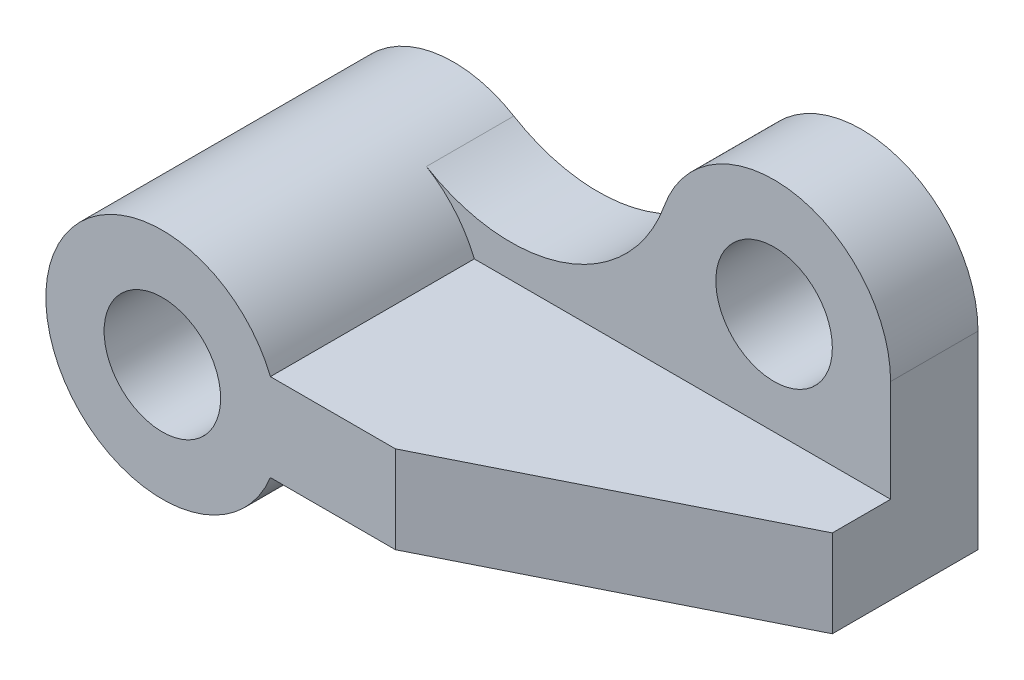
ISO-10303-21;
HEADER;
FILE_DESCRIPTION(('STEP AP214'),'2;1');
FILE_NAME('part.step','',(''),(''),'','','');
FILE_SCHEMA(('AUTOMOTIVE_DESIGN { 1 0 10303 214 1 1 1 1 }'));
ENDSEC;
DATA;
#1=APPLICATION_CONTEXT('core data for automotive mechanical design processes');
#2=APPLICATION_PROTOCOL_DEFINITION('international standard','automotive_design',2000,#1);
#3=PRODUCT_CONTEXT('',#1,'mechanical');
#4=PRODUCT('Part','Part','',(#3));
#5=PRODUCT_RELATED_PRODUCT_CATEGORY('part','',(#4));
#6=PRODUCT_DEFINITION_FORMATION('','',#4);
#7=PRODUCT_DEFINITION_CONTEXT('part definition',#1,'design');
#8=PRODUCT_DEFINITION('design','',#6,#7);
#9=PRODUCT_DEFINITION_SHAPE('','',#8);
#10=(LENGTH_UNIT() NAMED_UNIT(*) SI_UNIT(.MILLI.,.METRE.));
#11=(NAMED_UNIT(*) PLANE_ANGLE_UNIT() SI_UNIT($,.RADIAN.));
#12=(NAMED_UNIT(*) SI_UNIT($,.STERADIAN.) SOLID_ANGLE_UNIT());
#13=UNCERTAINTY_MEASURE_WITH_UNIT(LENGTH_MEASURE(1.E-05),#10,'distance_accuracy_value','');
#14=(GEOMETRIC_REPRESENTATION_CONTEXT(3) GLOBAL_UNCERTAINTY_ASSIGNED_CONTEXT((#13)) GLOBAL_UNIT_ASSIGNED_CONTEXT((#10,
#11,#12)) REPRESENTATION_CONTEXT('',''));
#15=CARTESIAN_POINT('',(0.,0.,0.));
#16=DIRECTION('',(0.,0.,1.));
#17=DIRECTION('',(1.,0.,0.));
#18=AXIS2_PLACEMENT_3D('',#15,#16,#17);
#19=CARTESIAN_POINT('',(0.,7.5,50.));
#20=DIRECTION('',(0.,1.,0.));
#21=DIRECTION('',(-1.,0.,0.));
#22=AXIS2_PLACEMENT_3D('',#19,#20,#21);
#23=PLANE('',#22);
#24=DIRECTION('',(1.,0.,0.));
#25=VECTOR('',#24,1.);
#26=CARTESIAN_POINT('',(0.,7.5,50.));
#27=LINE('',#26,#25);
#28=CARTESIAN_POINT('',(18.5404962177392,7.5,50.));
#29=VERTEX_POINT('',#28);
#30=CARTESIAN_POINT('',(39.9999999999996,7.5,50.));
#31=VERTEX_POINT('',#30);
#32=EDGE_CURVE('E154',#29,#31,#27,.T.);
#33=ORIENTED_EDGE('',*,*,#32,.T.);
#34=DIRECTION('',(-0.894427190999917,0.,0.447213595499956));
#35=VECTOR('',#34,1.);
#36=CARTESIAN_POINT('',(7.99999999999986,7.5,65.9999999999998));
#37=LINE('',#36,#35);
#38=CARTESIAN_POINT('',(90.,7.5,24.9999999999999));
#39=VERTEX_POINT('',#38);
#40=EDGE_CURVE('E11',#31,#39,#37,.F.);
#41=ORIENTED_EDGE('',*,*,#40,.T.);
#42=DIRECTION('',(0.,0.,-1.));
#43=VECTOR('',#42,1.);
#44=CARTESIAN_POINT('',(90.,7.5,50.));
#45=LINE('',#44,#43);
#46=CARTESIAN_POINT('',(90.,7.5,15.));
#47=VERTEX_POINT('',#46);
#48=EDGE_CURVE('E162',#39,#47,#45,.T.);
#49=ORIENTED_EDGE('',*,*,#48,.T.);
#50=DIRECTION('',(1.,0.,0.));
#51=VECTOR('',#50,1.);
#52=CARTESIAN_POINT('',(0.,7.5,15.));
#53=LINE('',#52,#51);
#54=CARTESIAN_POINT('',(18.5404962177392,7.5,15.));
#55=VERTEX_POINT('',#54);
#56=EDGE_CURVE('E130',#55,#47,#53,.T.);
#57=ORIENTED_EDGE('',*,*,#56,.F.);
#58=DIRECTION('',(0.,0.,-1.));
#59=VECTOR('',#58,1.);
#60=CARTESIAN_POINT('',(18.5404962177392,7.5,50.));
#61=LINE('',#60,#59);
#62=EDGE_CURVE('E129',#29,#55,#61,.T.);
#63=ORIENTED_EDGE('',*,*,#62,.F.);
#64=EDGE_LOOP('',(#33,#41,#49,#57,#63));
#65=FACE_BOUND('',#64,.T.);
#66=ADVANCED_FACE('F37',(#65),#23,.T.);
#67=CARTESIAN_POINT('',(0.,0.,50.));
#68=DIRECTION('',(0.,0.,-1.));
#69=DIRECTION('',(-1.,0.,0.));
#70=AXIS2_PLACEMENT_3D('',#67,#68,#69);
#71=CYLINDRICAL_SURFACE('',#70,20.);
#72=CARTESIAN_POINT('',(0.,0.,15.));
#73=DIRECTION('',(0.,0.,1.));
#74=DIRECTION('',(1.,0.,0.));
#75=AXIS2_PLACEMENT_3D('',#72,#73,#74);
#76=CIRCLE('',#75,20.);
#77=CARTESIAN_POINT('',(10.3263235063339,17.1279608489316,15.));
#78=VERTEX_POINT('',#77);
#79=EDGE_CURVE('E118',#55,#78,#76,.T.);
#80=ORIENTED_EDGE('',*,*,#79,.T.);
#81=DIRECTION('',(0.,0.,-1.));
#82=VECTOR('',#81,1.);
#83=CARTESIAN_POINT('',(10.3263235063339,17.1279608489316,15.));
#84=LINE('',#83,#82);
#85=CARTESIAN_POINT('',(10.3263235063339,17.1279608489316,0.));
#86=VERTEX_POINT('',#85);
#87=EDGE_CURVE('E102',#78,#86,#84,.T.);
#88=ORIENTED_EDGE('',*,*,#87,.T.);
#89=CARTESIAN_POINT('',(0.,0.,0.));
#90=DIRECTION('',(0.,0.,1.));
#91=DIRECTION('',(1.,0.,0.));
#92=AXIS2_PLACEMENT_3D('',#89,#90,#91);
#93=CIRCLE('',#92,20.);
#94=CARTESIAN_POINT('',(18.5404962177392,-7.5,0.));
#95=VERTEX_POINT('',#94);
#96=EDGE_CURVE('E165',#86,#95,#93,.T.);
#97=ORIENTED_EDGE('',*,*,#96,.T.);
#98=DIRECTION('',(0.,0.,-1.));
#99=VECTOR('',#98,1.);
#100=CARTESIAN_POINT('',(18.5404962177392,-7.5,50.));
#101=LINE('',#100,#99);
#102=CARTESIAN_POINT('',(18.5404962177392,-7.5,50.));
#103=VERTEX_POINT('',#102);
#104=EDGE_CURVE('E175',#103,#95,#101,.T.);
#105=ORIENTED_EDGE('',*,*,#104,.F.);
#106=CARTESIAN_POINT('',(0.,0.,50.));
#107=DIRECTION('',(0.,0.,1.));
#108=DIRECTION('',(1.,0.,0.));
#109=AXIS2_PLACEMENT_3D('',#106,#107,#108);
#110=CIRCLE('',#109,20.);
#111=EDGE_CURVE('E157',#29,#103,#110,.T.);
#112=ORIENTED_EDGE('',*,*,#111,.F.);
#113=ORIENTED_EDGE('',*,*,#62,.T.);
#114=EDGE_LOOP('',(#80,#88,#97,#105,#112,#113));
#115=FACE_BOUND('',#114,.T.);
#116=ADVANCED_FACE('F127',(#115),#71,.T.);
#117=CARTESIAN_POINT('',(0.,-7.5,50.));
#118=DIRECTION('',(0.,1.,0.));
#119=DIRECTION('',(-1.,0.,0.));
#120=AXIS2_PLACEMENT_3D('',#117,#118,#119);
#121=PLANE('',#120);
#122=DIRECTION('',(0.,0.,-1.));
#123=VECTOR('',#122,1.);
#124=CARTESIAN_POINT('',(90.,-7.5,50.));
#125=LINE('',#124,#123);
#126=CARTESIAN_POINT('',(90.,-7.5,24.9999999999999));
#127=VERTEX_POINT('',#126);
#128=CARTESIAN_POINT('',(90.,-7.5,0.));
#129=VERTEX_POINT('',#128);
#130=EDGE_CURVE('E173',#127,#129,#125,.T.);
#131=ORIENTED_EDGE('',*,*,#130,.F.);
#132=DIRECTION('',(0.894427190999917,0.,-0.447213595499956));
#133=VECTOR('',#132,1.);
#134=CARTESIAN_POINT('',(90.,-7.5,24.9999999999999));
#135=LINE('',#134,#133);
#136=CARTESIAN_POINT('',(39.9999999999996,-7.5,50.));
#137=VERTEX_POINT('',#136);
#138=EDGE_CURVE('E60',#127,#137,#135,.F.);
#139=ORIENTED_EDGE('',*,*,#138,.T.);
#140=DIRECTION('',(1.,0.,0.));
#141=VECTOR('',#140,1.);
#142=CARTESIAN_POINT('',(0.,-7.5,50.));
#143=LINE('',#142,#141);
#144=EDGE_CURVE('E160',#103,#137,#143,.T.);
#145=ORIENTED_EDGE('',*,*,#144,.F.);
#146=ORIENTED_EDGE('',*,*,#104,.T.);
#147=DIRECTION('',(1.,0.,0.));
#148=VECTOR('',#147,1.);
#149=CARTESIAN_POINT('',(0.,-7.5,0.));
#150=LINE('',#149,#148);
#151=EDGE_CURVE('E167',#95,#129,#150,.T.);
#152=ORIENTED_EDGE('',*,*,#151,.T.);
#153=EDGE_LOOP('',(#131,#139,#145,#146,#152));
#154=FACE_BOUND('',#153,.T.);
#155=ADVANCED_FACE('F188',(#154),#121,.F.);
#156=CARTESIAN_POINT('',(0.,0.,50.));
#157=DIRECTION('',(0.,0.,-1.));
#158=DIRECTION('',(-1.,0.,0.));
#159=AXIS2_PLACEMENT_3D('',#156,#157,#158);
#160=CYLINDRICAL_SURFACE('',#159,10.);
#161=CARTESIAN_POINT('',(0.,0.,50.));
#162=DIRECTION('',(0.,0.,1.));
#163=DIRECTION('',(1.,0.,0.));
#164=AXIS2_PLACEMENT_3D('',#161,#162,#163);
#165=CIRCLE('',#164,10.);
#166=CARTESIAN_POINT('',(10.,0.,50.));
#167=VERTEX_POINT('',#166);
#168=EDGE_CURVE('E151',#167,#167,#165,.T.);
#169=ORIENTED_EDGE('',*,*,#168,.T.);
#170=EDGE_LOOP('',(#169));
#171=FACE_BOUND('',#170,.T.);
#172=CARTESIAN_POINT('',(0.,0.,0.));
#173=DIRECTION('',(0.,0.,1.));
#174=DIRECTION('',(1.,0.,0.));
#175=AXIS2_PLACEMENT_3D('',#172,#173,#174);
#176=CIRCLE('',#175,10.);
#177=CARTESIAN_POINT('',(10.,0.,0.));
#178=VERTEX_POINT('',#177);
#179=EDGE_CURVE('E111',#178,#178,#176,.T.);
#180=ORIENTED_EDGE('',*,*,#179,.F.);
#181=EDGE_LOOP('',(#180));
#182=FACE_BOUND('',#181,.T.);
#183=ADVANCED_FACE('F211',(#171,#182),#160,.F.);
#184=CARTESIAN_POINT('',(90.,0.,50.));
#185=DIRECTION('',(1.,0.,0.));
#186=DIRECTION('',(0.,0.,-1.));
#187=AXIS2_PLACEMENT_3D('',#184,#185,#186);
#188=PLANE('',#187);
#189=ORIENTED_EDGE('',*,*,#48,.F.);
#190=DIRECTION('',(0.,-1.,0.));
#191=VECTOR('',#190,1.);
#192=CARTESIAN_POINT('',(90.,0.,24.9999999999999));
#193=LINE('',#192,#191);
#194=EDGE_CURVE('E179',#39,#127,#193,.T.);
#195=ORIENTED_EDGE('',*,*,#194,.T.);
#196=ORIENTED_EDGE('',*,*,#130,.T.);
#197=DIRECTION('',(0.,-1.,0.));
#198=VECTOR('',#197,1.);
#199=CARTESIAN_POINT('',(90.,0.,0.));
#200=LINE('',#199,#198);
#201=CARTESIAN_POINT('',(90.,25.,0.));
#202=VERTEX_POINT('',#201);
#203=EDGE_CURVE('E155',#202,#129,#200,.T.);
#204=ORIENTED_EDGE('',*,*,#203,.F.);
#205=DIRECTION('',(0.,0.,-1.));
#206=VECTOR('',#205,1.);
#207=CARTESIAN_POINT('',(90.,25.,15.));
#208=LINE('',#207,#206);
#209=CARTESIAN_POINT('',(90.,25.,15.));
#210=VERTEX_POINT('',#209);
#211=EDGE_CURVE('E112',#210,#202,#208,.T.);
#212=ORIENTED_EDGE('',*,*,#211,.F.);
#213=DIRECTION('',(0.,-1.,0.));
#214=VECTOR('',#213,1.);
#215=CARTESIAN_POINT('',(90.,0.,15.));
#216=LINE('',#215,#214);
#217=EDGE_CURVE('E132',#210,#47,#216,.T.);
#218=ORIENTED_EDGE('',*,*,#217,.T.);
#219=EDGE_LOOP('',(#189,#195,#196,#204,#212,#218));
#220=FACE_BOUND('',#219,.T.);
#221=ADVANCED_FACE('F185',(#220),#188,.T.);
#222=CARTESIAN_POINT('',(0.,0.,50.));
#223=DIRECTION('',(0.,0.,1.));
#224=DIRECTION('',(1.,0.,0.));
#225=AXIS2_PLACEMENT_3D('',#222,#223,#224);
#226=PLANE('',#225);
#227=ORIENTED_EDGE('',*,*,#168,.F.);
#228=EDGE_LOOP('',(#227));
#229=FACE_BOUND('',#228,.T.);
#230=ORIENTED_EDGE('',*,*,#144,.T.);
#231=DIRECTION('',(0.,1.,0.));
#232=VECTOR('',#231,1.);
#233=CARTESIAN_POINT('',(39.9999999999996,0.,50.));
#234=LINE('',#233,#232);
#235=EDGE_CURVE('E46',#137,#31,#234,.T.);
#236=ORIENTED_EDGE('',*,*,#235,.T.);
#237=ORIENTED_EDGE('',*,*,#32,.F.);
#238=ORIENTED_EDGE('',*,*,#111,.T.);
#239=EDGE_LOOP('',(#230,#236,#237,#238));
#240=FACE_BOUND('',#239,.T.);
#241=ADVANCED_FACE('F218',(#229,#240),#226,.T.);
#242=CARTESIAN_POINT('',(0.,0.,0.));
#243=DIRECTION('',(0.,0.,1.));
#244=DIRECTION('',(1.,0.,0.));
#245=AXIS2_PLACEMENT_3D('',#242,#243,#244);
#246=PLANE('',#245);
#247=ORIENTED_EDGE('',*,*,#96,.F.);
#248=CARTESIAN_POINT('',(24.7831764152014,41.1071060374359,0.));
#249=DIRECTION('',(0.,0.,1.));
#250=DIRECTION('',(1.,0.,0.));
#251=AXIS2_PLACEMENT_3D('',#248,#249,#250);
#252=CIRCLE('',#251,28.);
#253=CARTESIAN_POINT('',(51.1596568396673,31.711294182265,0.));
#254=VERTEX_POINT('',#253);
#255=EDGE_CURVE('E107',#86,#254,#252,.T.);
#256=ORIENTED_EDGE('',*,*,#255,.T.);
#257=CARTESIAN_POINT('',(70.,25.,0.));
#258=DIRECTION('',(0.,0.,1.));
#259=DIRECTION('',(1.,0.,0.));
#260=AXIS2_PLACEMENT_3D('',#257,#258,#259);
#261=CIRCLE('',#260,20.);
#262=EDGE_CURVE('E143',#202,#254,#261,.T.);
#263=ORIENTED_EDGE('',*,*,#262,.F.);
#264=ORIENTED_EDGE('',*,*,#203,.T.);
#265=ORIENTED_EDGE('',*,*,#151,.F.);
#266=EDGE_LOOP('',(#247,#256,#263,#264,#265));
#267=FACE_BOUND('',#266,.T.);
#268=ORIENTED_EDGE('',*,*,#179,.T.);
#269=EDGE_LOOP('',(#268));
#270=FACE_BOUND('',#269,.T.);
#271=CARTESIAN_POINT('',(70.,25.,0.));
#272=DIRECTION('',(0.,0.,1.));
#273=DIRECTION('',(1.,0.,0.));
#274=AXIS2_PLACEMENT_3D('',#271,#272,#273);
#275=CIRCLE('',#274,9.99999999999999);
#276=CARTESIAN_POINT('',(80.,25.,0.));
#277=VERTEX_POINT('',#276);
#278=EDGE_CURVE('E124',#277,#277,#275,.T.);
#279=ORIENTED_EDGE('',*,*,#278,.T.);
#280=EDGE_LOOP('',(#279));
#281=FACE_BOUND('',#280,.T.);
#282=ADVANCED_FACE('F193',(#267,#270,#281),#246,.F.);
#283=CARTESIAN_POINT('',(24.7831764152014,41.1071060374359,15.));
#284=DIRECTION('',(0.,0.,-1.));
#285=DIRECTION('',(-1.,0.,0.));
#286=AXIS2_PLACEMENT_3D('',#283,#284,#285);
#287=CYLINDRICAL_SURFACE('',#286,28.);
#288=ORIENTED_EDGE('',*,*,#255,.F.);
#289=ORIENTED_EDGE('',*,*,#87,.F.);
#290=CARTESIAN_POINT('',(24.7831764152014,41.1071060374359,15.));
#291=DIRECTION('',(0.,0.,1.));
#292=DIRECTION('',(1.,0.,0.));
#293=AXIS2_PLACEMENT_3D('',#290,#291,#292);
#294=CIRCLE('',#293,28.);
#295=CARTESIAN_POINT('',(51.1596568396673,31.711294182265,15.));
#296=VERTEX_POINT('',#295);
#297=EDGE_CURVE('E105',#78,#296,#294,.T.);
#298=ORIENTED_EDGE('',*,*,#297,.T.);
#299=DIRECTION('',(0.,0.,-1.));
#300=VECTOR('',#299,1.);
#301=CARTESIAN_POINT('',(51.1596568396673,31.711294182265,15.));
#302=LINE('',#301,#300);
#303=EDGE_CURVE('E141',#296,#254,#302,.T.);
#304=ORIENTED_EDGE('',*,*,#303,.T.);
#305=EDGE_LOOP('',(#288,#289,#298,#304));
#306=FACE_BOUND('',#305,.T.);
#307=ADVANCED_FACE('F104',(#306),#287,.F.);
#308=CARTESIAN_POINT('',(70.,25.,15.));
#309=DIRECTION('',(0.,0.,-1.));
#310=DIRECTION('',(-1.,0.,0.));
#311=AXIS2_PLACEMENT_3D('',#308,#309,#310);
#312=CYLINDRICAL_SURFACE('',#311,20.);
#313=ORIENTED_EDGE('',*,*,#262,.T.);
#314=ORIENTED_EDGE('',*,*,#303,.F.);
#315=CARTESIAN_POINT('',(70.,25.,15.));
#316=DIRECTION('',(0.,0.,1.));
#317=DIRECTION('',(1.,0.,0.));
#318=AXIS2_PLACEMENT_3D('',#315,#316,#317);
#319=CIRCLE('',#318,20.);
#320=EDGE_CURVE('E122',#210,#296,#319,.T.);
#321=ORIENTED_EDGE('',*,*,#320,.F.);
#322=ORIENTED_EDGE('',*,*,#211,.T.);
#323=EDGE_LOOP('',(#313,#314,#321,#322));
#324=FACE_BOUND('',#323,.T.);
#325=ADVANCED_FACE('F196',(#324),#312,.T.);
#326=CARTESIAN_POINT('',(70.,25.,15.));
#327=DIRECTION('',(0.,0.,-1.));
#328=DIRECTION('',(-1.,0.,0.));
#329=AXIS2_PLACEMENT_3D('',#326,#327,#328);
#330=CYLINDRICAL_SURFACE('',#329,9.99999999999999);
#331=CARTESIAN_POINT('',(70.,25.,15.));
#332=DIRECTION('',(0.,0.,1.));
#333=DIRECTION('',(1.,0.,0.));
#334=AXIS2_PLACEMENT_3D('',#331,#332,#333);
#335=CIRCLE('',#334,9.99999999999999);
#336=CARTESIAN_POINT('',(80.,25.,15.));
#337=VERTEX_POINT('',#336);
#338=EDGE_CURVE('E138',#337,#337,#335,.T.);
#339=ORIENTED_EDGE('',*,*,#338,.T.);
#340=EDGE_LOOP('',(#339));
#341=FACE_BOUND('',#340,.T.);
#342=ORIENTED_EDGE('',*,*,#278,.F.);
#343=EDGE_LOOP('',(#342));
#344=FACE_BOUND('',#343,.T.);
#345=ADVANCED_FACE('F202',(#341,#344),#330,.F.);
#346=CARTESIAN_POINT('',(0.,0.,15.));
#347=DIRECTION('',(0.,0.,1.));
#348=DIRECTION('',(1.,0.,0.));
#349=AXIS2_PLACEMENT_3D('',#346,#347,#348);
#350=PLANE('',#349);
#351=ORIENTED_EDGE('',*,*,#297,.F.);
#352=ORIENTED_EDGE('',*,*,#79,.F.);
#353=ORIENTED_EDGE('',*,*,#56,.T.);
#354=ORIENTED_EDGE('',*,*,#217,.F.);
#355=ORIENTED_EDGE('',*,*,#320,.T.);
#356=EDGE_LOOP('',(#351,#352,#353,#354,#355));
#357=FACE_BOUND('',#356,.T.);
#358=ORIENTED_EDGE('',*,*,#338,.F.);
#359=EDGE_LOOP('',(#358));
#360=FACE_BOUND('',#359,.T.);
#361=ADVANCED_FACE('F115',(#357,#360),#350,.T.);
#362=CARTESIAN_POINT('',(90.,0.,24.9999999999999));
#363=DIRECTION('',(-0.447213595499956,0.,-0.894427190999917));
#364=DIRECTION('',(0.,-1.,0.));
#365=AXIS2_PLACEMENT_3D('',#362,#363,#364);
#366=PLANE('',#365);
#367=ORIENTED_EDGE('',*,*,#40,.F.);
#368=ORIENTED_EDGE('',*,*,#235,.F.);
#369=ORIENTED_EDGE('',*,*,#138,.F.);
#370=ORIENTED_EDGE('',*,*,#194,.F.);
#371=EDGE_LOOP('',(#367,#368,#369,#370));
#372=FACE_BOUND('',#371,.T.);
#373=ADVANCED_FACE('F40',(#372),#366,.F.);
#374=CLOSED_SHELL('',(#66,#116,#155,#183,#221,#241,#282,#307,#325,#345,#361,#373));
#375=MANIFOLD_SOLID_BREP('B2',#374);
#376=ADVANCED_BREP_SHAPE_REPRESENTATION('',(#18,#375),#14);
#377=SHAPE_DEFINITION_REPRESENTATION(#9,#376);
ENDSEC;
END-ISO-10303-21;
